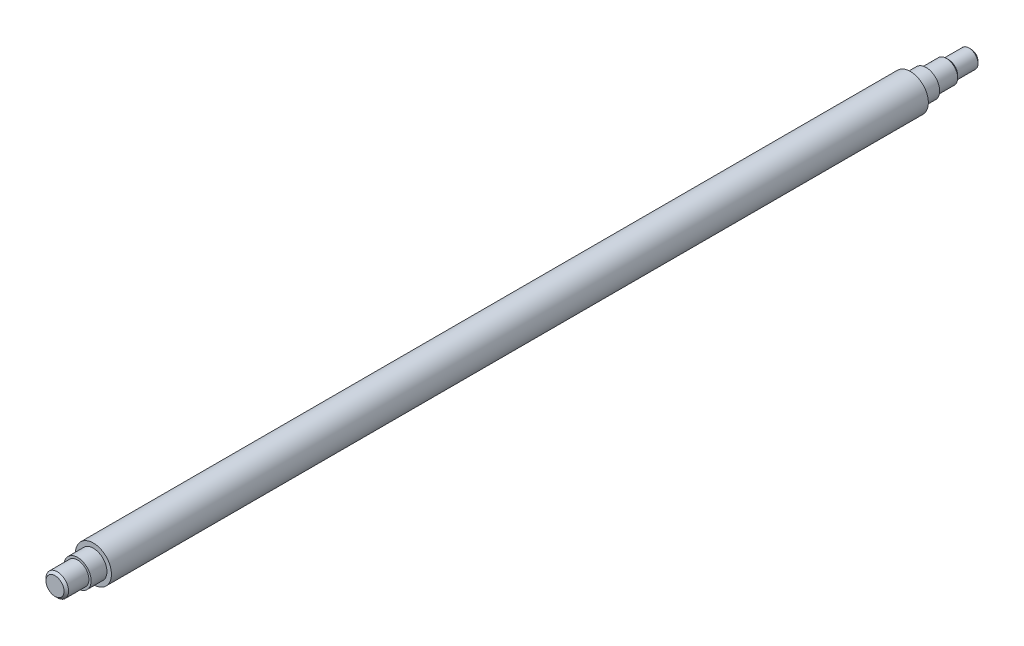
ISO-10303-21;
HEADER;
FILE_DESCRIPTION(('STEP AP214'),'2;1');
FILE_NAME('part.step','',(''),(''),'','','');
FILE_SCHEMA(('AUTOMOTIVE_DESIGN { 1 0 10303 214 1 1 1 1 }'));
ENDSEC;
DATA;
#1=APPLICATION_CONTEXT('core data for automotive mechanical design processes');
#2=APPLICATION_PROTOCOL_DEFINITION('international standard','automotive_design',2000,#1);
#3=PRODUCT_CONTEXT('',#1,'mechanical');
#4=PRODUCT('Part','Part','',(#3));
#5=PRODUCT_RELATED_PRODUCT_CATEGORY('part','',(#4));
#6=PRODUCT_DEFINITION_FORMATION('','',#4);
#7=PRODUCT_DEFINITION_CONTEXT('part definition',#1,'design');
#8=PRODUCT_DEFINITION('design','',#6,#7);
#9=PRODUCT_DEFINITION_SHAPE('','',#8);
#10=(LENGTH_UNIT() NAMED_UNIT(*) SI_UNIT(.MILLI.,.METRE.));
#11=(NAMED_UNIT(*) PLANE_ANGLE_UNIT() SI_UNIT($,.RADIAN.));
#12=(NAMED_UNIT(*) SI_UNIT($,.STERADIAN.) SOLID_ANGLE_UNIT());
#13=UNCERTAINTY_MEASURE_WITH_UNIT(LENGTH_MEASURE(1.E-05),#10,'distance_accuracy_value','');
#14=(GEOMETRIC_REPRESENTATION_CONTEXT(3) GLOBAL_UNCERTAINTY_ASSIGNED_CONTEXT((#13)) GLOBAL_UNIT_ASSIGNED_CONTEXT((#10,
#11,#12)) REPRESENTATION_CONTEXT('',''));
#15=CARTESIAN_POINT('',(0.,0.,0.));
#16=DIRECTION('',(0.,0.,1.));
#17=DIRECTION('',(1.,0.,0.));
#18=AXIS2_PLACEMENT_3D('',#15,#16,#17);
#19=CARTESIAN_POINT('',(0.,0.,369.));
#20=DIRECTION('',(0.,0.,1.));
#21=DIRECTION('',(1.,0.,0.));
#22=AXIS2_PLACEMENT_3D('',#19,#20,#21);
#23=PLANE('',#22);
#24=CARTESIAN_POINT('',(0.,0.,369.));
#25=DIRECTION('',(0.,0.,1.));
#26=DIRECTION('',(1.,0.,0.));
#27=AXIS2_PLACEMENT_3D('',#24,#25,#26);
#28=CIRCLE('',#27,6.);
#29=CARTESIAN_POINT('',(6.,0.,369.));
#30=VERTEX_POINT('',#29);
#31=EDGE_CURVE('E74',#30,#30,#28,.T.);
#32=ORIENTED_EDGE('',*,*,#31,.T.);
#33=EDGE_LOOP('',(#32));
#34=FACE_BOUND('',#33,.T.);
#35=CARTESIAN_POINT('',(0.,0.,369.));
#36=DIRECTION('',(0.,0.,1.));
#37=DIRECTION('',(1.,0.,0.));
#38=AXIS2_PLACEMENT_3D('',#35,#36,#37);
#39=CIRCLE('',#38,5.);
#40=CARTESIAN_POINT('',(5.,0.,369.));
#41=VERTEX_POINT('',#40);
#42=EDGE_CURVE('E77',#41,#41,#39,.T.);
#43=ORIENTED_EDGE('',*,*,#42,.F.);
#44=EDGE_LOOP('',(#43));
#45=FACE_BOUND('',#44,.T.);
#46=ADVANCED_FACE('F30',(#34,#45),#23,.T.);
#47=CARTESIAN_POINT('',(0.,0.,362.));
#48=DIRECTION('',(0.,0.,1.));
#49=DIRECTION('',(1.,0.,0.));
#50=AXIS2_PLACEMENT_3D('',#47,#48,#49);
#51=PLANE('',#50);
#52=CARTESIAN_POINT('',(0.,0.,362.));
#53=DIRECTION('',(0.,0.,1.));
#54=DIRECTION('',(1.,0.,0.));
#55=AXIS2_PLACEMENT_3D('',#52,#53,#54);
#56=CIRCLE('',#55,8.);
#57=CARTESIAN_POINT('',(8.,0.,362.));
#58=VERTEX_POINT('',#57);
#59=EDGE_CURVE('E56',#58,#58,#56,.T.);
#60=ORIENTED_EDGE('',*,*,#59,.T.);
#61=EDGE_LOOP('',(#60));
#62=FACE_BOUND('',#61,.T.);
#63=CARTESIAN_POINT('',(0.,0.,362.));
#64=DIRECTION('',(0.,0.,1.));
#65=DIRECTION('',(1.,0.,0.));
#66=AXIS2_PLACEMENT_3D('',#63,#64,#65);
#67=CIRCLE('',#66,6.);
#68=CARTESIAN_POINT('',(6.,0.,362.));
#69=VERTEX_POINT('',#68);
#70=EDGE_CURVE('E71',#69,#69,#67,.T.);
#71=ORIENTED_EDGE('',*,*,#70,.F.);
#72=EDGE_LOOP('',(#71));
#73=FACE_BOUND('',#72,.T.);
#74=ADVANCED_FACE('F84',(#62,#73),#51,.T.);
#75=CARTESIAN_POINT('',(0.,0.,-7.));
#76=DIRECTION('',(0.,0.,-1.));
#77=DIRECTION('',(-1.,0.,0.));
#78=AXIS2_PLACEMENT_3D('',#75,#76,#77);
#79=PLANE('',#78);
#80=CARTESIAN_POINT('',(0.,0.,-7.));
#81=DIRECTION('',(0.,0.,-1.));
#82=DIRECTION('',(-1.,0.,0.));
#83=AXIS2_PLACEMENT_3D('',#80,#81,#82);
#84=CIRCLE('',#83,6.);
#85=CARTESIAN_POINT('',(-6.,0.,-7.));
#86=VERTEX_POINT('',#85);
#87=EDGE_CURVE('E60',#86,#86,#84,.T.);
#88=ORIENTED_EDGE('',*,*,#87,.T.);
#89=EDGE_LOOP('',(#88));
#90=FACE_BOUND('',#89,.T.);
#91=CARTESIAN_POINT('',(0.,0.,-7.));
#92=DIRECTION('',(0.,0.,-1.));
#93=DIRECTION('',(-1.,0.,0.));
#94=AXIS2_PLACEMENT_3D('',#91,#92,#93);
#95=CIRCLE('',#94,5.);
#96=CARTESIAN_POINT('',(-5.,0.,-7.));
#97=VERTEX_POINT('',#96);
#98=EDGE_CURVE('E65',#97,#97,#95,.T.);
#99=ORIENTED_EDGE('',*,*,#98,.F.);
#100=EDGE_LOOP('',(#99));
#101=FACE_BOUND('',#100,.T.);
#102=ADVANCED_FACE('F90',(#90,#101),#79,.T.);
#103=CARTESIAN_POINT('',(0.,0.,0.));
#104=DIRECTION('',(0.,0.,1.));
#105=DIRECTION('',(1.,0.,0.));
#106=AXIS2_PLACEMENT_3D('',#103,#104,#105);
#107=PLANE('',#106);
#108=CARTESIAN_POINT('',(0.,0.,0.));
#109=DIRECTION('',(0.,0.,1.));
#110=DIRECTION('',(1.,0.,0.));
#111=AXIS2_PLACEMENT_3D('',#108,#109,#110);
#112=CIRCLE('',#111,8.);
#113=CARTESIAN_POINT('',(8.,0.,0.));
#114=VERTEX_POINT('',#113);
#115=EDGE_CURVE('E57',#114,#114,#112,.T.);
#116=ORIENTED_EDGE('',*,*,#115,.F.);
#117=EDGE_LOOP('',(#116));
#118=FACE_BOUND('',#117,.T.);
#119=CARTESIAN_POINT('',(0.,0.,0.));
#120=DIRECTION('',(0.,0.,1.));
#121=DIRECTION('',(1.,0.,0.));
#122=AXIS2_PLACEMENT_3D('',#119,#120,#121);
#123=CIRCLE('',#122,6.);
#124=CARTESIAN_POINT('',(6.,0.,0.));
#125=VERTEX_POINT('',#124);
#126=EDGE_CURVE('E53',#125,#125,#123,.F.);
#127=ORIENTED_EDGE('',*,*,#126,.F.);
#128=EDGE_LOOP('',(#127));
#129=FACE_BOUND('',#128,.T.);
#130=ADVANCED_FACE('F117',(#118,#129),#107,.F.);
#131=CARTESIAN_POINT('',(0.,0.,362.));
#132=DIRECTION('',(0.,0.,-1.));
#133=DIRECTION('',(-1.,0.,0.));
#134=AXIS2_PLACEMENT_3D('',#131,#132,#133);
#135=CYLINDRICAL_SURFACE('',#134,8.);
#136=ORIENTED_EDGE('',*,*,#59,.F.);
#137=EDGE_LOOP('',(#136));
#138=FACE_BOUND('',#137,.T.);
#139=ORIENTED_EDGE('',*,*,#115,.T.);
#140=EDGE_LOOP('',(#139));
#141=FACE_BOUND('',#140,.T.);
#142=ADVANCED_FACE('F120',(#138,#141),#135,.T.);
#143=CARTESIAN_POINT('',(0.,0.,-5.));
#144=DIRECTION('',(0.,0.,1.));
#145=DIRECTION('',(1.,0.,0.));
#146=AXIS2_PLACEMENT_3D('',#143,#144,#145);
#147=CYLINDRICAL_SURFACE('',#146,6.);
#148=ORIENTED_EDGE('',*,*,#126,.T.);
#149=EDGE_LOOP('',(#148));
#150=FACE_BOUND('',#149,.T.);
#151=ORIENTED_EDGE('',*,*,#87,.F.);
#152=EDGE_LOOP('',(#151));
#153=FACE_BOUND('',#152,.T.);
#154=ADVANCED_FACE('F113',(#150,#153),#147,.T.);
#155=CARTESIAN_POINT('',(0.,0.,-17.));
#156=DIRECTION('',(0.,0.,1.));
#157=DIRECTION('',(1.,0.,0.));
#158=AXIS2_PLACEMENT_3D('',#155,#156,#157);
#159=CYLINDRICAL_SURFACE('',#158,5.);
#160=CARTESIAN_POINT('',(0.,0.,-16.));
#161=DIRECTION('',(0.,0.,-1.));
#162=DIRECTION('',(-1.,0.,0.));
#163=AXIS2_PLACEMENT_3D('',#160,#161,#162);
#164=CIRCLE('',#163,5.);
#165=CARTESIAN_POINT('',(-5.,0.,-16.));
#166=VERTEX_POINT('',#165);
#167=EDGE_CURVE('E50',#166,#166,#164,.F.);
#168=ORIENTED_EDGE('',*,*,#167,.T.);
#169=EDGE_LOOP('',(#168));
#170=FACE_BOUND('',#169,.T.);
#171=ORIENTED_EDGE('',*,*,#98,.T.);
#172=EDGE_LOOP('',(#171));
#173=FACE_BOUND('',#172,.T.);
#174=ADVANCED_FACE('F109',(#170,#173),#159,.T.);
#175=CARTESIAN_POINT('',(0.,0.,-27.));
#176=DIRECTION('',(0.,0.,1.));
#177=DIRECTION('',(1.,0.,0.));
#178=AXIS2_PLACEMENT_3D('',#175,#176,#177);
#179=CYLINDRICAL_SURFACE('',#178,4.);
#180=CARTESIAN_POINT('',(0.,0.,-26.));
#181=DIRECTION('',(0.,0.,-1.));
#182=DIRECTION('',(-1.,0.,0.));
#183=AXIS2_PLACEMENT_3D('',#180,#181,#182);
#184=CIRCLE('',#183,4.);
#185=CARTESIAN_POINT('',(-4.,0.,-26.));
#186=VERTEX_POINT('',#185);
#187=EDGE_CURVE('E41',#186,#186,#184,.F.);
#188=ORIENTED_EDGE('',*,*,#187,.T.);
#189=EDGE_LOOP('',(#188));
#190=FACE_BOUND('',#189,.T.);
#191=CARTESIAN_POINT('',(0.,0.,-17.));
#192=DIRECTION('',(0.,0.,-1.));
#193=DIRECTION('',(-1.,0.,0.));
#194=AXIS2_PLACEMENT_3D('',#191,#192,#193);
#195=CIRCLE('',#194,4.);
#196=CARTESIAN_POINT('',(-4.,0.,-17.));
#197=VERTEX_POINT('',#196);
#198=EDGE_CURVE('E68',#197,#197,#195,.T.);
#199=ORIENTED_EDGE('',*,*,#198,.T.);
#200=EDGE_LOOP('',(#199));
#201=FACE_BOUND('',#200,.T.);
#202=ADVANCED_FACE('F105',(#190,#201),#179,.T.);
#203=CARTESIAN_POINT('',(0.,0.,-27.));
#204=DIRECTION('',(0.,0.,-1.));
#205=DIRECTION('',(-1.,0.,0.));
#206=AXIS2_PLACEMENT_3D('',#203,#204,#205);
#207=PLANE('',#206);
#208=CARTESIAN_POINT('',(0.,0.,-27.));
#209=DIRECTION('',(0.,0.,-1.));
#210=DIRECTION('',(-1.,0.,0.));
#211=AXIS2_PLACEMENT_3D('',#208,#209,#210);
#212=CIRCLE('',#211,3.00000000000006);
#213=CARTESIAN_POINT('',(-3.00000000000006,0.,-27.));
#214=VERTEX_POINT('',#213);
#215=EDGE_CURVE('E45',#214,#214,#212,.T.);
#216=ORIENTED_EDGE('',*,*,#215,.T.);
#217=EDGE_LOOP('',(#216));
#218=FACE_BOUND('',#217,.T.);
#219=ADVANCED_FACE('F101',(#218),#207,.T.);
#220=CARTESIAN_POINT('',(0.,0.,-17.));
#221=DIRECTION('',(0.,0.,1.));
#222=DIRECTION('',(1.,0.,0.));
#223=AXIS2_PLACEMENT_3D('',#220,#221,#222);
#224=CONICAL_SURFACE('',#223,4.00000000000006,0.785398163397439);
#225=ORIENTED_EDGE('',*,*,#167,.F.);
#226=EDGE_LOOP('',(#225));
#227=FACE_BOUND('',#226,.T.);
#228=ORIENTED_EDGE('',*,*,#198,.F.);
#229=EDGE_LOOP('',(#228));
#230=FACE_BOUND('',#229,.T.);
#231=ADVANCED_FACE('F104',(#227,#230),#224,.T.);
#232=CARTESIAN_POINT('',(0.,0.,-27.));
#233=DIRECTION('',(0.,0.,1.));
#234=DIRECTION('',(1.,0.,0.));
#235=AXIS2_PLACEMENT_3D('',#232,#233,#234);
#236=CONICAL_SURFACE('',#235,3.00000000000006,0.785398163397414);
#237=ORIENTED_EDGE('',*,*,#187,.F.);
#238=EDGE_LOOP('',(#237));
#239=FACE_BOUND('',#238,.T.);
#240=ORIENTED_EDGE('',*,*,#215,.F.);
#241=EDGE_LOOP('',(#240));
#242=FACE_BOUND('',#241,.T.);
#243=ADVANCED_FACE('F99',(#239,#242),#236,.T.);
#244=CARTESIAN_POINT('',(0.,0.,367.));
#245=DIRECTION('',(0.,0.,-1.));
#246=DIRECTION('',(-1.,0.,0.));
#247=AXIS2_PLACEMENT_3D('',#244,#245,#246);
#248=CYLINDRICAL_SURFACE('',#247,6.);
#249=ORIENTED_EDGE('',*,*,#70,.T.);
#250=EDGE_LOOP('',(#249));
#251=FACE_BOUND('',#250,.T.);
#252=ORIENTED_EDGE('',*,*,#31,.F.);
#253=EDGE_LOOP('',(#252));
#254=FACE_BOUND('',#253,.T.);
#255=ADVANCED_FACE('F96',(#251,#254),#248,.T.);
#256=CARTESIAN_POINT('',(0.,0.,379.));
#257=DIRECTION('',(0.,0.,-1.));
#258=DIRECTION('',(-1.,0.,0.));
#259=AXIS2_PLACEMENT_3D('',#256,#257,#258);
#260=CYLINDRICAL_SURFACE('',#259,5.);
#261=CARTESIAN_POINT('',(0.,0.,378.));
#262=DIRECTION('',(0.,0.,1.));
#263=DIRECTION('',(1.,0.,0.));
#264=AXIS2_PLACEMENT_3D('',#261,#262,#263);
#265=CIRCLE('',#264,5.);
#266=CARTESIAN_POINT('',(5.,0.,378.));
#267=VERTEX_POINT('',#266);
#268=EDGE_CURVE('E10',#267,#267,#265,.F.);
#269=ORIENTED_EDGE('',*,*,#268,.T.);
#270=EDGE_LOOP('',(#269));
#271=FACE_BOUND('',#270,.T.);
#272=ORIENTED_EDGE('',*,*,#42,.T.);
#273=EDGE_LOOP('',(#272));
#274=FACE_BOUND('',#273,.T.);
#275=ADVANCED_FACE('F81',(#271,#274),#260,.T.);
#276=CARTESIAN_POINT('',(0.,0.,379.));
#277=DIRECTION('',(0.,0.,1.));
#278=DIRECTION('',(1.,0.,0.));
#279=AXIS2_PLACEMENT_3D('',#276,#277,#278);
#280=PLANE('',#279);
#281=CARTESIAN_POINT('',(0.,0.,379.));
#282=DIRECTION('',(0.,0.,1.));
#283=DIRECTION('',(1.,0.,0.));
#284=AXIS2_PLACEMENT_3D('',#281,#282,#283);
#285=CIRCLE('',#284,4.);
#286=CARTESIAN_POINT('',(4.,0.,379.));
#287=VERTEX_POINT('',#286);
#288=EDGE_CURVE('E37',#287,#287,#285,.T.);
#289=ORIENTED_EDGE('',*,*,#288,.T.);
#290=EDGE_LOOP('',(#289));
#291=FACE_BOUND('',#290,.T.);
#292=ADVANCED_FACE('F155',(#291),#280,.T.);
#293=CARTESIAN_POINT('',(0.,0.,379.));
#294=DIRECTION('',(0.,0.,-1.));
#295=DIRECTION('',(-1.,0.,0.));
#296=AXIS2_PLACEMENT_3D('',#293,#294,#295);
#297=CONICAL_SURFACE('',#296,4.,0.785398163397474);
#298=ORIENTED_EDGE('',*,*,#268,.F.);
#299=EDGE_LOOP('',(#298));
#300=FACE_BOUND('',#299,.T.);
#301=ORIENTED_EDGE('',*,*,#288,.F.);
#302=EDGE_LOOP('',(#301));
#303=FACE_BOUND('',#302,.T.);
#304=ADVANCED_FACE('F32',(#300,#303),#297,.T.);
#305=CLOSED_SHELL('',(#46,#74,#102,#130,#142,#154,#174,#202,#219,#231,#243,#255,#275,#292,#304));
#306=MANIFOLD_SOLID_BREP('B2',#305);
#307=ADVANCED_BREP_SHAPE_REPRESENTATION('',(#18,#306),#14);
#308=SHAPE_DEFINITION_REPRESENTATION(#9,#307);
ENDSEC;
END-ISO-10303-21;
